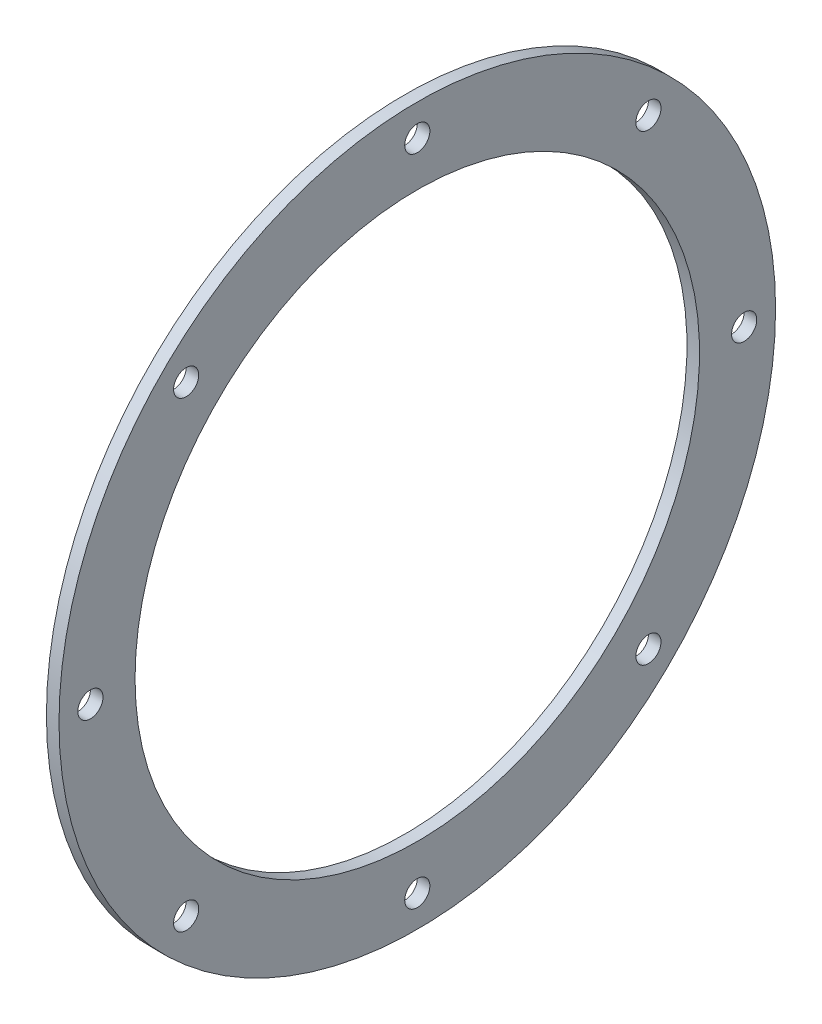
ISO-10303-21;
HEADER;
FILE_DESCRIPTION(('STEP AP214'),'2;1');
FILE_NAME('part.step','',(''),(''),'','','');
FILE_SCHEMA(('AUTOMOTIVE_DESIGN { 1 0 10303 214 1 1 1 1 }'));
ENDSEC;
DATA;
#1=APPLICATION_CONTEXT('core data for automotive mechanical design processes');
#2=APPLICATION_PROTOCOL_DEFINITION('international standard','automotive_design',2000,#1);
#3=PRODUCT_CONTEXT('',#1,'mechanical');
#4=PRODUCT('Part','Part','',(#3));
#5=PRODUCT_RELATED_PRODUCT_CATEGORY('part','',(#4));
#6=PRODUCT_DEFINITION_FORMATION('','',#4);
#7=PRODUCT_DEFINITION_CONTEXT('part definition',#1,'design');
#8=PRODUCT_DEFINITION('design','',#6,#7);
#9=PRODUCT_DEFINITION_SHAPE('','',#8);
#10=(LENGTH_UNIT() NAMED_UNIT(*) SI_UNIT(.MILLI.,.METRE.));
#11=(NAMED_UNIT(*) PLANE_ANGLE_UNIT() SI_UNIT($,.RADIAN.));
#12=(NAMED_UNIT(*) SI_UNIT($,.STERADIAN.) SOLID_ANGLE_UNIT());
#13=UNCERTAINTY_MEASURE_WITH_UNIT(LENGTH_MEASURE(1.E-05),#10,'distance_accuracy_value','');
#14=(GEOMETRIC_REPRESENTATION_CONTEXT(3) GLOBAL_UNCERTAINTY_ASSIGNED_CONTEXT((#13)) GLOBAL_UNIT_ASSIGNED_CONTEXT((#10,
#11,#12)) REPRESENTATION_CONTEXT('',''));
#15=CARTESIAN_POINT('',(0.,0.,0.));
#16=DIRECTION('',(0.,0.,1.));
#17=DIRECTION('',(1.,0.,0.));
#18=AXIS2_PLACEMENT_3D('',#15,#16,#17);
#19=CARTESIAN_POINT('',(11.7498384295794,0.,0.));
#20=DIRECTION('',(1.,0.,0.));
#21=DIRECTION('',(0.,0.,-1.));
#22=AXIS2_PLACEMENT_3D('',#19,#20,#21);
#23=PLANE('',#22);
#24=CARTESIAN_POINT('',(11.7498384295794,-1.81557029619843E-13,-52.));
#25=DIRECTION('',(1.,0.,0.));
#26=DIRECTION('',(0.,-1.,0.));
#27=AXIS2_PLACEMENT_3D('',#24,#25,#26);
#28=CIRCLE('',#27,2.);
#29=CARTESIAN_POINT('',(11.7498384295794,-2.00000000000019,-52.));
#30=VERTEX_POINT('',#29);
#31=EDGE_CURVE('E101',#30,#30,#28,.T.);
#32=ORIENTED_EDGE('',*,*,#31,.F.);
#33=EDGE_LOOP('',(#32));
#34=FACE_BOUND('',#33,.T.);
#35=CARTESIAN_POINT('',(11.7498384295794,-36.7695526217007,-36.7695526217003));
#36=DIRECTION('',(1.,0.,0.));
#37=DIRECTION('',(0.,-0.707106781186544,0.707106781186551));
#38=AXIS2_PLACEMENT_3D('',#35,#36,#37);
#39=CIRCLE('',#38,2.);
#40=CARTESIAN_POINT('',(11.7498384295794,-38.1837661840737,-35.3553390593272));
#41=VERTEX_POINT('',#40);
#42=EDGE_CURVE('E93',#41,#41,#39,.T.);
#43=ORIENTED_EDGE('',*,*,#42,.F.);
#44=EDGE_LOOP('',(#43));
#45=FACE_BOUND('',#44,.T.);
#46=CARTESIAN_POINT('',(11.7498384295794,-52.,0.));
#47=DIRECTION('',(1.,0.,0.));
#48=DIRECTION('',(0.,0.,1.));
#49=AXIS2_PLACEMENT_3D('',#46,#47,#48);
#50=CIRCLE('',#49,2.);
#51=CARTESIAN_POINT('',(11.7498384295794,-52.,2.));
#52=VERTEX_POINT('',#51);
#53=EDGE_CURVE('E83',#52,#52,#50,.T.);
#54=ORIENTED_EDGE('',*,*,#53,.F.);
#55=EDGE_LOOP('',(#54));
#56=FACE_BOUND('',#55,.T.);
#57=CARTESIAN_POINT('',(11.7498384295794,-36.7695526217002,36.7695526217008));
#58=DIRECTION('',(1.,0.,0.));
#59=DIRECTION('',(0.,0.707106781186554,0.707106781186541));
#60=AXIS2_PLACEMENT_3D('',#57,#58,#59);
#61=CIRCLE('',#60,2.);
#62=CARTESIAN_POINT('',(11.7498384295794,-35.355339059327,38.1837661840739));
#63=VERTEX_POINT('',#62);
#64=EDGE_CURVE('E84',#63,#63,#61,.T.);
#65=ORIENTED_EDGE('',*,*,#64,.F.);
#66=EDGE_LOOP('',(#65));
#67=FACE_BOUND('',#66,.T.);
#68=CARTESIAN_POINT('',(11.7498384295794,5.44671088859529E-13,52.));
#69=DIRECTION('',(1.,0.,0.));
#70=DIRECTION('',(0.,1.,0.));
#71=AXIS2_PLACEMENT_3D('',#68,#69,#70);
#72=CIRCLE('',#71,2.);
#73=CARTESIAN_POINT('',(11.7498384295794,2.00000000000055,52.));
#74=VERTEX_POINT('',#73);
#75=EDGE_CURVE('E115',#74,#74,#72,.T.);
#76=ORIENTED_EDGE('',*,*,#75,.F.);
#77=EDGE_LOOP('',(#76));
#78=FACE_BOUND('',#77,.T.);
#79=CARTESIAN_POINT('',(11.7498384295794,36.7695526217009,36.7695526217));
#80=DIRECTION('',(1.,0.,0.));
#81=DIRECTION('',(0.,0.707106781186539,-0.707106781186556));
#82=AXIS2_PLACEMENT_3D('',#79,#80,#81);
#83=CIRCLE('',#82,2.);
#84=CARTESIAN_POINT('',(11.7498384295794,38.183766184074,35.3553390593269));
#85=VERTEX_POINT('',#84);
#86=EDGE_CURVE('E116',#85,#85,#83,.T.);
#87=ORIENTED_EDGE('',*,*,#86,.F.);
#88=EDGE_LOOP('',(#87));
#89=FACE_BOUND('',#88,.T.);
#90=CARTESIAN_POINT('',(11.7498384295794,36.7695526217004,-36.7695526217005));
#91=DIRECTION('',(1.,0.,0.));
#92=DIRECTION('',(0.,-0.707106781186549,-0.707106781186546));
#93=AXIS2_PLACEMENT_3D('',#90,#91,#92);
#94=CIRCLE('',#93,2.);
#95=CARTESIAN_POINT('',(11.7498384295794,35.3553390593273,-38.1837661840736));
#96=VERTEX_POINT('',#95);
#97=EDGE_CURVE('E74',#96,#96,#94,.T.);
#98=ORIENTED_EDGE('',*,*,#97,.F.);
#99=EDGE_LOOP('',(#98));
#100=FACE_BOUND('',#99,.T.);
#101=CARTESIAN_POINT('',(11.7498384295794,52.,0.));
#102=DIRECTION('',(1.,0.,0.));
#103=DIRECTION('',(0.,0.,-1.));
#104=AXIS2_PLACEMENT_3D('',#101,#102,#103);
#105=CIRCLE('',#104,2.);
#106=CARTESIAN_POINT('',(11.7498384295794,52.,-2.));
#107=VERTEX_POINT('',#106);
#108=EDGE_CURVE('E62',#107,#107,#105,.T.);
#109=ORIENTED_EDGE('',*,*,#108,.F.);
#110=EDGE_LOOP('',(#109));
#111=FACE_BOUND('',#110,.T.);
#112=CARTESIAN_POINT('',(11.7498384295794,0.,0.));
#113=DIRECTION('',(-1.,0.,0.));
#114=DIRECTION('',(0.,0.,1.));
#115=AXIS2_PLACEMENT_3D('',#112,#113,#114);
#116=CIRCLE('',#115,44.9);
#117=CARTESIAN_POINT('',(11.7498384295794,0.,44.9));
#118=VERTEX_POINT('',#117);
#119=EDGE_CURVE('E56',#118,#118,#116,.T.);
#120=ORIENTED_EDGE('',*,*,#119,.T.);
#121=EDGE_LOOP('',(#120));
#122=FACE_BOUND('',#121,.T.);
#123=CARTESIAN_POINT('',(11.7498384295793,0.,0.));
#124=DIRECTION('',(-1.,0.,0.));
#125=DIRECTION('',(0.,0.,1.));
#126=AXIS2_PLACEMENT_3D('',#123,#124,#125);
#127=CIRCLE('',#126,57.);
#128=CARTESIAN_POINT('',(11.7498384295793,0.,57.));
#129=VERTEX_POINT('',#128);
#130=EDGE_CURVE('E10',#129,#129,#127,.T.);
#131=ORIENTED_EDGE('',*,*,#130,.F.);
#132=EDGE_LOOP('',(#131));
#133=FACE_BOUND('',#132,.T.);
#134=ADVANCED_FACE('F39',(#34,#45,#56,#67,#78,#89,#100,#111,#122,#133),#23,.T.);
#135=CARTESIAN_POINT('',(-478.111946856672,0.,0.));
#136=DIRECTION('',(-1.,0.,0.));
#137=DIRECTION('',(0.,0.,1.));
#138=AXIS2_PLACEMENT_3D('',#135,#136,#137);
#139=CYLINDRICAL_SURFACE('',#138,57.);
#140=ORIENTED_EDGE('',*,*,#130,.T.);
#141=EDGE_LOOP('',(#140));
#142=FACE_BOUND('',#141,.T.);
#143=CARTESIAN_POINT('',(9.74983842957933,0.,0.));
#144=DIRECTION('',(-1.,0.,0.));
#145=DIRECTION('',(0.,0.,1.));
#146=AXIS2_PLACEMENT_3D('',#143,#144,#145);
#147=CIRCLE('',#146,57.);
#148=CARTESIAN_POINT('',(9.74983842957933,0.,57.));
#149=VERTEX_POINT('',#148);
#150=EDGE_CURVE('E46',#149,#149,#147,.T.);
#151=ORIENTED_EDGE('',*,*,#150,.F.);
#152=EDGE_LOOP('',(#151));
#153=FACE_BOUND('',#152,.T.);
#154=ADVANCED_FACE('F132',(#142,#153),#139,.T.);
#155=CARTESIAN_POINT('',(9.74983842957935,0.,0.));
#156=DIRECTION('',(1.,0.,0.));
#157=DIRECTION('',(0.,0.,-1.));
#158=AXIS2_PLACEMENT_3D('',#155,#156,#157);
#159=PLANE('',#158);
#160=CARTESIAN_POINT('',(9.74983842957935,-1.81557029619843E-13,-52.));
#161=DIRECTION('',(-1.,0.,0.));
#162=DIRECTION('',(0.,1.,0.));
#163=AXIS2_PLACEMENT_3D('',#160,#161,#162);
#164=CIRCLE('',#163,2.);
#165=CARTESIAN_POINT('',(9.74983842957935,1.99999999999982,-52.));
#166=VERTEX_POINT('',#165);
#167=EDGE_CURVE('E78',#166,#166,#164,.T.);
#168=ORIENTED_EDGE('',*,*,#167,.F.);
#169=EDGE_LOOP('',(#168));
#170=FACE_BOUND('',#169,.T.);
#171=CARTESIAN_POINT('',(9.74983842957935,-36.7695526217007,-36.7695526217003));
#172=DIRECTION('',(-1.,0.,0.));
#173=DIRECTION('',(0.,0.707106781186544,-0.707106781186551));
#174=AXIS2_PLACEMENT_3D('',#171,#172,#173);
#175=CIRCLE('',#174,2.);
#176=CARTESIAN_POINT('',(9.74983842957935,-35.3553390593276,-38.1837661840734));
#177=VERTEX_POINT('',#176);
#178=EDGE_CURVE('E97',#177,#177,#175,.T.);
#179=ORIENTED_EDGE('',*,*,#178,.F.);
#180=EDGE_LOOP('',(#179));
#181=FACE_BOUND('',#180,.T.);
#182=CARTESIAN_POINT('',(9.74983842957935,-52.,0.));
#183=DIRECTION('',(-1.,0.,0.));
#184=DIRECTION('',(0.,0.,-1.));
#185=AXIS2_PLACEMENT_3D('',#182,#183,#184);
#186=CIRCLE('',#185,2.);
#187=CARTESIAN_POINT('',(9.74983842957935,-52.,-2.));
#188=VERTEX_POINT('',#187);
#189=EDGE_CURVE('E89',#188,#188,#186,.T.);
#190=ORIENTED_EDGE('',*,*,#189,.F.);
#191=EDGE_LOOP('',(#190));
#192=FACE_BOUND('',#191,.T.);
#193=CARTESIAN_POINT('',(9.74983842957935,-36.7695526217002,36.7695526217008));
#194=DIRECTION('',(-1.,0.,0.));
#195=DIRECTION('',(0.,-0.707106781186554,-0.707106781186541));
#196=AXIS2_PLACEMENT_3D('',#193,#194,#195);
#197=CIRCLE('',#196,2.);
#198=CARTESIAN_POINT('',(9.74983842957935,-38.1837661840733,35.3553390593277));
#199=VERTEX_POINT('',#198);
#200=EDGE_CURVE('E79',#199,#199,#197,.T.);
#201=ORIENTED_EDGE('',*,*,#200,.F.);
#202=EDGE_LOOP('',(#201));
#203=FACE_BOUND('',#202,.T.);
#204=CARTESIAN_POINT('',(9.74983842957935,5.44671088859529E-13,52.));
#205=DIRECTION('',(-1.,0.,0.));
#206=DIRECTION('',(0.,-1.,0.));
#207=AXIS2_PLACEMENT_3D('',#204,#205,#206);
#208=CIRCLE('',#207,2.);
#209=CARTESIAN_POINT('',(9.74983842957935,-1.99999999999946,52.));
#210=VERTEX_POINT('',#209);
#211=EDGE_CURVE('E88',#210,#210,#208,.T.);
#212=ORIENTED_EDGE('',*,*,#211,.F.);
#213=EDGE_LOOP('',(#212));
#214=FACE_BOUND('',#213,.T.);
#215=CARTESIAN_POINT('',(9.74983842957935,36.7695526217009,36.7695526217));
#216=DIRECTION('',(-1.,0.,0.));
#217=DIRECTION('',(0.,-0.707106781186539,0.707106781186556));
#218=AXIS2_PLACEMENT_3D('',#215,#216,#217);
#219=CIRCLE('',#218,2.);
#220=CARTESIAN_POINT('',(9.74983842957935,35.3553390593278,38.1837661840731));
#221=VERTEX_POINT('',#220);
#222=EDGE_CURVE('E111',#221,#221,#219,.T.);
#223=ORIENTED_EDGE('',*,*,#222,.F.);
#224=EDGE_LOOP('',(#223));
#225=FACE_BOUND('',#224,.T.);
#226=CARTESIAN_POINT('',(9.74983842957935,36.7695526217004,-36.7695526217005));
#227=DIRECTION('',(-1.,0.,0.));
#228=DIRECTION('',(0.,0.707106781186549,0.707106781186546));
#229=AXIS2_PLACEMENT_3D('',#226,#227,#228);
#230=CIRCLE('',#229,2.);
#231=CARTESIAN_POINT('',(9.74983842957935,38.1837661840735,-35.3553390593274));
#232=VERTEX_POINT('',#231);
#233=EDGE_CURVE('E70',#232,#232,#230,.T.);
#234=ORIENTED_EDGE('',*,*,#233,.F.);
#235=EDGE_LOOP('',(#234));
#236=FACE_BOUND('',#235,.T.);
#237=CARTESIAN_POINT('',(9.74983842957935,52.,0.));
#238=DIRECTION('',(-1.,0.,0.));
#239=DIRECTION('',(0.,0.,1.));
#240=AXIS2_PLACEMENT_3D('',#237,#238,#239);
#241=CIRCLE('',#240,2.);
#242=CARTESIAN_POINT('',(9.74983842957935,52.,2.));
#243=VERTEX_POINT('',#242);
#244=EDGE_CURVE('E66',#243,#243,#241,.T.);
#245=ORIENTED_EDGE('',*,*,#244,.F.);
#246=EDGE_LOOP('',(#245));
#247=FACE_BOUND('',#246,.T.);
#248=CARTESIAN_POINT('',(9.74983842957933,0.,0.));
#249=DIRECTION('',(-1.,0.,0.));
#250=DIRECTION('',(0.,0.,1.));
#251=AXIS2_PLACEMENT_3D('',#248,#249,#250);
#252=CIRCLE('',#251,44.9);
#253=CARTESIAN_POINT('',(9.74983842957933,0.,44.9));
#254=VERTEX_POINT('',#253);
#255=EDGE_CURVE('E51',#254,#254,#252,.T.);
#256=ORIENTED_EDGE('',*,*,#255,.F.);
#257=EDGE_LOOP('',(#256));
#258=FACE_BOUND('',#257,.T.);
#259=ORIENTED_EDGE('',*,*,#150,.T.);
#260=EDGE_LOOP('',(#259));
#261=FACE_BOUND('',#260,.T.);
#262=ADVANCED_FACE('F147',(#170,#181,#192,#203,#214,#225,#236,#247,#258,#261),#159,.F.);
#263=CARTESIAN_POINT('',(-478.111946856672,0.,0.));
#264=DIRECTION('',(-1.,0.,0.));
#265=DIRECTION('',(0.,0.,1.));
#266=AXIS2_PLACEMENT_3D('',#263,#264,#265);
#267=CYLINDRICAL_SURFACE('',#266,44.9);
#268=ORIENTED_EDGE('',*,*,#119,.F.);
#269=EDGE_LOOP('',(#268));
#270=FACE_BOUND('',#269,.T.);
#271=ORIENTED_EDGE('',*,*,#255,.T.);
#272=EDGE_LOOP('',(#271));
#273=FACE_BOUND('',#272,.T.);
#274=ADVANCED_FACE('F143',(#270,#273),#267,.F.);
#275=CARTESIAN_POINT('',(19.7498384295793,52.,0.));
#276=DIRECTION('',(-1.,0.,0.));
#277=DIRECTION('',(0.,0.,1.));
#278=AXIS2_PLACEMENT_3D('',#275,#276,#277);
#279=CYLINDRICAL_SURFACE('',#278,2.);
#280=ORIENTED_EDGE('',*,*,#108,.T.);
#281=EDGE_LOOP('',(#280));
#282=FACE_BOUND('',#281,.T.);
#283=ORIENTED_EDGE('',*,*,#244,.T.);
#284=EDGE_LOOP('',(#283));
#285=FACE_BOUND('',#284,.T.);
#286=ADVANCED_FACE('F146',(#282,#285),#279,.F.);
#287=CARTESIAN_POINT('',(19.7498384295793,36.7695526217004,-36.7695526217005));
#288=DIRECTION('',(-1.,0.,0.));
#289=DIRECTION('',(0.,0.707106781186549,0.707106781186546));
#290=AXIS2_PLACEMENT_3D('',#287,#288,#289);
#291=CYLINDRICAL_SURFACE('',#290,2.);
#292=ORIENTED_EDGE('',*,*,#97,.T.);
#293=EDGE_LOOP('',(#292));
#294=FACE_BOUND('',#293,.T.);
#295=ORIENTED_EDGE('',*,*,#233,.T.);
#296=EDGE_LOOP('',(#295));
#297=FACE_BOUND('',#296,.T.);
#298=ADVANCED_FACE('F162',(#294,#297),#291,.F.);
#299=CARTESIAN_POINT('',(19.7498384295793,36.7695526217009,36.7695526217));
#300=DIRECTION('',(-1.,0.,0.));
#301=DIRECTION('',(0.,-0.707106781186539,0.707106781186556));
#302=AXIS2_PLACEMENT_3D('',#299,#300,#301);
#303=CYLINDRICAL_SURFACE('',#302,2.);
#304=ORIENTED_EDGE('',*,*,#86,.T.);
#305=EDGE_LOOP('',(#304));
#306=FACE_BOUND('',#305,.T.);
#307=ORIENTED_EDGE('',*,*,#222,.T.);
#308=EDGE_LOOP('',(#307));
#309=FACE_BOUND('',#308,.T.);
#310=ADVANCED_FACE('F166',(#306,#309),#303,.F.);
#311=CARTESIAN_POINT('',(19.7498384295793,5.44671088859529E-13,52.));
#312=DIRECTION('',(-1.,0.,0.));
#313=DIRECTION('',(0.,-1.,0.));
#314=AXIS2_PLACEMENT_3D('',#311,#312,#313);
#315=CYLINDRICAL_SURFACE('',#314,2.);
#316=ORIENTED_EDGE('',*,*,#75,.T.);
#317=EDGE_LOOP('',(#316));
#318=FACE_BOUND('',#317,.T.);
#319=ORIENTED_EDGE('',*,*,#211,.T.);
#320=EDGE_LOOP('',(#319));
#321=FACE_BOUND('',#320,.T.);
#322=ADVANCED_FACE('F127',(#318,#321),#315,.F.);
#323=CARTESIAN_POINT('',(19.7498384295793,-36.7695526217002,36.7695526217008));
#324=DIRECTION('',(-1.,0.,0.));
#325=DIRECTION('',(0.,-0.707106781186554,-0.707106781186541));
#326=AXIS2_PLACEMENT_3D('',#323,#324,#325);
#327=CYLINDRICAL_SURFACE('',#326,2.);
#328=ORIENTED_EDGE('',*,*,#64,.T.);
#329=EDGE_LOOP('',(#328));
#330=FACE_BOUND('',#329,.T.);
#331=ORIENTED_EDGE('',*,*,#200,.T.);
#332=EDGE_LOOP('',(#331));
#333=FACE_BOUND('',#332,.T.);
#334=ADVANCED_FACE('F168',(#330,#333),#327,.F.);
#335=CARTESIAN_POINT('',(19.7498384295793,-52.,0.));
#336=DIRECTION('',(-1.,0.,0.));
#337=DIRECTION('',(0.,0.,-1.));
#338=AXIS2_PLACEMENT_3D('',#335,#336,#337);
#339=CYLINDRICAL_SURFACE('',#338,2.);
#340=ORIENTED_EDGE('',*,*,#53,.T.);
#341=EDGE_LOOP('',(#340));
#342=FACE_BOUND('',#341,.T.);
#343=ORIENTED_EDGE('',*,*,#189,.T.);
#344=EDGE_LOOP('',(#343));
#345=FACE_BOUND('',#344,.T.);
#346=ADVANCED_FACE('F171',(#342,#345),#339,.F.);
#347=CARTESIAN_POINT('',(19.7498384295793,-36.7695526217007,-36.7695526217003));
#348=DIRECTION('',(-1.,0.,0.));
#349=DIRECTION('',(0.,0.707106781186544,-0.707106781186551));
#350=AXIS2_PLACEMENT_3D('',#347,#348,#349);
#351=CYLINDRICAL_SURFACE('',#350,2.);
#352=ORIENTED_EDGE('',*,*,#42,.T.);
#353=EDGE_LOOP('',(#352));
#354=FACE_BOUND('',#353,.T.);
#355=ORIENTED_EDGE('',*,*,#178,.T.);
#356=EDGE_LOOP('',(#355));
#357=FACE_BOUND('',#356,.T.);
#358=ADVANCED_FACE('F175',(#354,#357),#351,.F.);
#359=CARTESIAN_POINT('',(19.7498384295793,-1.81557029619843E-13,-52.));
#360=DIRECTION('',(-1.,0.,0.));
#361=DIRECTION('',(0.,1.,0.));
#362=AXIS2_PLACEMENT_3D('',#359,#360,#361);
#363=CYLINDRICAL_SURFACE('',#362,2.);
#364=ORIENTED_EDGE('',*,*,#31,.T.);
#365=EDGE_LOOP('',(#364));
#366=FACE_BOUND('',#365,.T.);
#367=ORIENTED_EDGE('',*,*,#167,.T.);
#368=EDGE_LOOP('',(#367));
#369=FACE_BOUND('',#368,.T.);
#370=ADVANCED_FACE('F179',(#366,#369),#363,.F.);
#371=CLOSED_SHELL('',(#134,#154,#262,#274,#286,#298,#310,#322,#334,#346,#358,#370));
#372=MANIFOLD_SOLID_BREP('B2',#371);
#373=ADVANCED_BREP_SHAPE_REPRESENTATION('',(#18,#372),#14);
#374=SHAPE_DEFINITION_REPRESENTATION(#9,#373);
ENDSEC;
END-ISO-10303-21;
